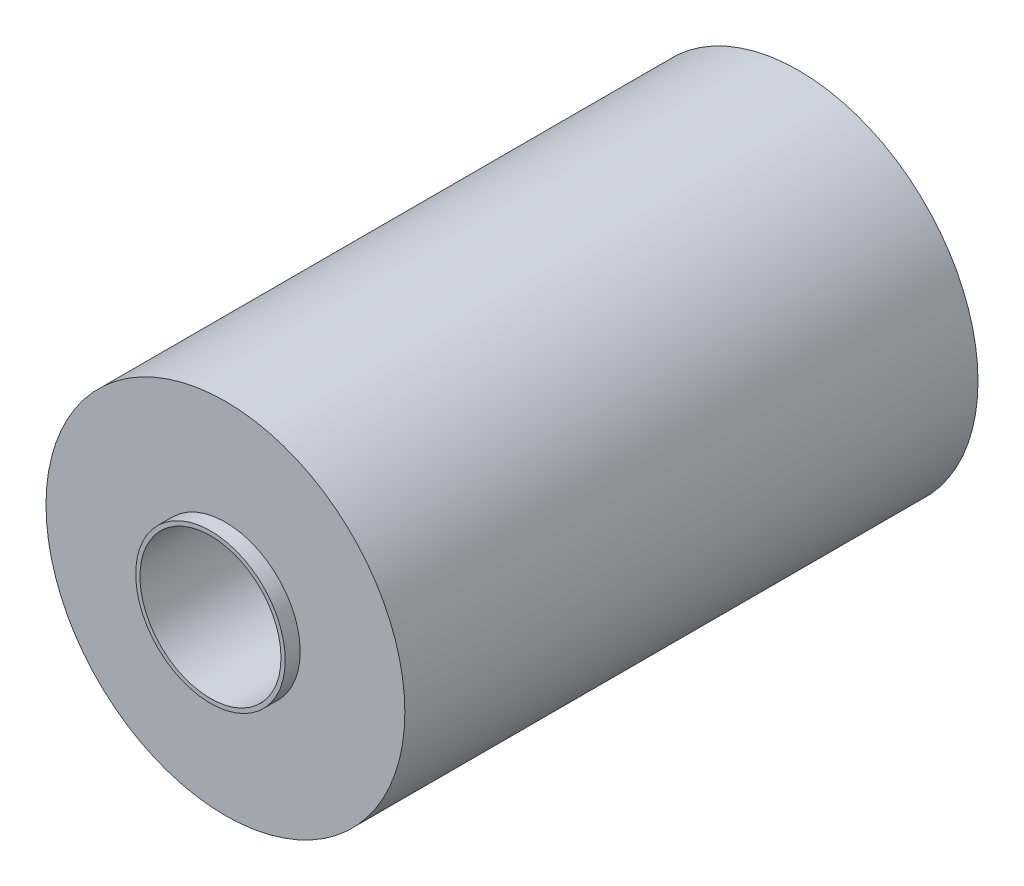
ISO-10303-21;
HEADER;
FILE_DESCRIPTION(('STEP AP214'),'2;1');
FILE_NAME('part.step','',(''),(''),'','','');
FILE_SCHEMA(('AUTOMOTIVE_DESIGN { 1 0 10303 214 1 1 1 1 }'));
ENDSEC;
DATA;
#1=APPLICATION_CONTEXT('core data for automotive mechanical design processes');
#2=APPLICATION_PROTOCOL_DEFINITION('international standard','automotive_design',2000,#1);
#3=PRODUCT_CONTEXT('',#1,'mechanical');
#4=PRODUCT('Part','Part','',(#3));
#5=PRODUCT_RELATED_PRODUCT_CATEGORY('part','',(#4));
#6=PRODUCT_DEFINITION_FORMATION('','',#4);
#7=PRODUCT_DEFINITION_CONTEXT('part definition',#1,'design');
#8=PRODUCT_DEFINITION('design','',#6,#7);
#9=PRODUCT_DEFINITION_SHAPE('','',#8);
#10=(LENGTH_UNIT() NAMED_UNIT(*) SI_UNIT(.MILLI.,.METRE.));
#11=(NAMED_UNIT(*) PLANE_ANGLE_UNIT() SI_UNIT($,.RADIAN.));
#12=(NAMED_UNIT(*) SI_UNIT($,.STERADIAN.) SOLID_ANGLE_UNIT());
#13=UNCERTAINTY_MEASURE_WITH_UNIT(LENGTH_MEASURE(1.E-05),#10,'distance_accuracy_value','');
#14=(GEOMETRIC_REPRESENTATION_CONTEXT(3) GLOBAL_UNCERTAINTY_ASSIGNED_CONTEXT((#13)) GLOBAL_UNIT_ASSIGNED_CONTEXT((#10,
#11,#12)) REPRESENTATION_CONTEXT('',''));
#15=CARTESIAN_POINT('',(0.,0.,0.));
#16=DIRECTION('',(0.,0.,1.));
#17=DIRECTION('',(1.,0.,0.));
#18=AXIS2_PLACEMENT_3D('',#15,#16,#17);
#19=CARTESIAN_POINT('',(0.,0.,105.926406871193));
#20=DIRECTION('',(0.,0.,-1.));
#21=DIRECTION('',(-1.,0.,0.));
#22=AXIS2_PLACEMENT_3D('',#19,#20,#21);
#23=CYLINDRICAL_SURFACE('',#22,15.);
#24=CARTESIAN_POINT('',(0.,0.,60.5));
#25=DIRECTION('',(0.,0.,1.));
#26=DIRECTION('',(1.,0.,0.));
#27=AXIS2_PLACEMENT_3D('',#24,#25,#26);
#28=CIRCLE('',#27,15.);
#29=CARTESIAN_POINT('',(15.,0.,60.5));
#30=VERTEX_POINT('',#29);
#31=EDGE_CURVE('E11',#30,#30,#28,.T.);
#32=ORIENTED_EDGE('',*,*,#31,.F.);
#33=EDGE_LOOP('',(#32));
#34=FACE_BOUND('',#33,.T.);
#35=CARTESIAN_POINT('',(0.,0.,-57.5));
#36=DIRECTION('',(0.,0.,1.));
#37=DIRECTION('',(1.,0.,0.));
#38=AXIS2_PLACEMENT_3D('',#35,#36,#37);
#39=CIRCLE('',#38,15.);
#40=CARTESIAN_POINT('',(15.,0.,-57.5));
#41=VERTEX_POINT('',#40);
#42=EDGE_CURVE('E61',#41,#41,#39,.F.);
#43=ORIENTED_EDGE('',*,*,#42,.F.);
#44=EDGE_LOOP('',(#43));
#45=FACE_BOUND('',#44,.T.);
#46=ADVANCED_FACE('F47',(#34,#45),#23,.T.);
#47=CARTESIAN_POINT('',(0.,0.,105.926406871193));
#48=DIRECTION('',(0.,0.,-1.));
#49=DIRECTION('',(-1.,0.,0.));
#50=AXIS2_PLACEMENT_3D('',#47,#48,#49);
#51=CYLINDRICAL_SURFACE('',#50,14.15);
#52=CARTESIAN_POINT('',(0.,0.,60.5));
#53=DIRECTION('',(0.,0.,1.));
#54=DIRECTION('',(1.,0.,0.));
#55=AXIS2_PLACEMENT_3D('',#52,#53,#54);
#56=CIRCLE('',#55,14.15);
#57=CARTESIAN_POINT('',(14.15,0.,60.5));
#58=VERTEX_POINT('',#57);
#59=EDGE_CURVE('E50',#58,#58,#56,.T.);
#60=ORIENTED_EDGE('',*,*,#59,.T.);
#61=EDGE_LOOP('',(#60));
#62=FACE_BOUND('',#61,.T.);
#63=CARTESIAN_POINT('',(0.,0.,-57.5));
#64=DIRECTION('',(0.,0.,1.));
#65=DIRECTION('',(1.,0.,0.));
#66=AXIS2_PLACEMENT_3D('',#63,#64,#65);
#67=CIRCLE('',#66,14.15);
#68=CARTESIAN_POINT('',(14.15,0.,-57.5));
#69=VERTEX_POINT('',#68);
#70=EDGE_CURVE('E57',#69,#69,#67,.F.);
#71=ORIENTED_EDGE('',*,*,#70,.T.);
#72=EDGE_LOOP('',(#71));
#73=FACE_BOUND('',#72,.T.);
#74=ADVANCED_FACE('F69',(#62,#73),#51,.F.);
#75=CARTESIAN_POINT('',(0.,0.,60.5));
#76=DIRECTION('',(0.,0.,1.));
#77=DIRECTION('',(1.,0.,0.));
#78=AXIS2_PLACEMENT_3D('',#75,#76,#77);
#79=PLANE('',#78);
#80=ORIENTED_EDGE('',*,*,#59,.F.);
#81=EDGE_LOOP('',(#80));
#82=FACE_BOUND('',#81,.T.);
#83=ORIENTED_EDGE('',*,*,#31,.T.);
#84=EDGE_LOOP('',(#83));
#85=FACE_BOUND('',#84,.T.);
#86=ADVANCED_FACE('F74',(#82,#85),#79,.T.);
#87=CARTESIAN_POINT('',(0.,0.,-57.5));
#88=DIRECTION('',(0.,0.,1.));
#89=DIRECTION('',(1.,0.,0.));
#90=AXIS2_PLACEMENT_3D('',#87,#88,#89);
#91=PLANE('',#90);
#92=ORIENTED_EDGE('',*,*,#42,.T.);
#93=EDGE_LOOP('',(#92));
#94=FACE_BOUND('',#93,.T.);
#95=ORIENTED_EDGE('',*,*,#70,.F.);
#96=EDGE_LOOP('',(#95));
#97=FACE_BOUND('',#96,.T.);
#98=ADVANCED_FACE('F65',(#94,#97),#91,.F.);
#99=CLOSED_SHELL('',(#46,#74,#86,#98));
#100=MANIFOLD_SOLID_BREP('B2',#99);
#101=CARTESIAN_POINT('',(0.,0.,57.5));
#102=DIRECTION('',(0.,0.,1.));
#103=DIRECTION('',(1.,0.,0.));
#104=AXIS2_PLACEMENT_3D('',#101,#102,#103);
#105=PLANE('',#104);
#106=CARTESIAN_POINT('',(0.,0.,57.5));
#107=DIRECTION('',(0.,0.,1.));
#108=DIRECTION('',(1.,0.,0.));
#109=AXIS2_PLACEMENT_3D('',#106,#107,#108);
#110=CIRCLE('',#109,36.);
#111=CARTESIAN_POINT('',(36.,0.,57.5));
#112=VERTEX_POINT('',#111);
#113=EDGE_CURVE('E46',#112,#112,#110,.T.);
#114=ORIENTED_EDGE('',*,*,#113,.T.);
#115=EDGE_LOOP('',(#114));
#116=FACE_BOUND('',#115,.T.);
#117=CARTESIAN_POINT('',(0.,0.,57.5));
#118=DIRECTION('',(0.,0.,1.));
#119=DIRECTION('',(1.,0.,0.));
#120=AXIS2_PLACEMENT_3D('',#117,#118,#119);
#121=CIRCLE('',#120,15.);
#122=CARTESIAN_POINT('',(15.,0.,57.5));
#123=VERTEX_POINT('',#122);
#124=EDGE_CURVE('E120',#123,#123,#121,.T.);
#125=ORIENTED_EDGE('',*,*,#124,.F.);
#126=EDGE_LOOP('',(#125));
#127=FACE_BOUND('',#126,.T.);
#128=ADVANCED_FACE('F109',(#116,#127),#105,.T.);
#129=CARTESIAN_POINT('',(0.,0.,-57.5));
#130=DIRECTION('',(0.,0.,1.));
#131=DIRECTION('',(1.,0.,0.));
#132=AXIS2_PLACEMENT_3D('',#129,#130,#131);
#133=PLANE('',#132);
#134=CARTESIAN_POINT('',(0.,0.,-57.5));
#135=DIRECTION('',(0.,0.,1.));
#136=DIRECTION('',(1.,0.,0.));
#137=AXIS2_PLACEMENT_3D('',#134,#135,#136);
#138=CIRCLE('',#137,36.);
#139=CARTESIAN_POINT('',(36.,0.,-57.5));
#140=VERTEX_POINT('',#139);
#141=EDGE_CURVE('E113',#140,#140,#138,.T.);
#142=ORIENTED_EDGE('',*,*,#141,.F.);
#143=EDGE_LOOP('',(#142));
#144=FACE_BOUND('',#143,.T.);
#145=CARTESIAN_POINT('',(0.,0.,-57.5));
#146=DIRECTION('',(0.,0.,1.));
#147=DIRECTION('',(1.,0.,0.));
#148=AXIS2_PLACEMENT_3D('',#145,#146,#147);
#149=CIRCLE('',#148,15.);
#150=CARTESIAN_POINT('',(15.,0.,-57.5));
#151=VERTEX_POINT('',#150);
#152=EDGE_CURVE('E122',#151,#151,#149,.T.);
#153=ORIENTED_EDGE('',*,*,#152,.T.);
#154=EDGE_LOOP('',(#153));
#155=FACE_BOUND('',#154,.T.);
#156=ADVANCED_FACE('F132',(#144,#155),#133,.F.);
#157=CARTESIAN_POINT('',(0.,0.,57.5));
#158=DIRECTION('',(0.,0.,-1.));
#159=DIRECTION('',(-1.,0.,0.));
#160=AXIS2_PLACEMENT_3D('',#157,#158,#159);
#161=CYLINDRICAL_SURFACE('',#160,36.);
#162=ORIENTED_EDGE('',*,*,#113,.F.);
#163=EDGE_LOOP('',(#162));
#164=FACE_BOUND('',#163,.T.);
#165=ORIENTED_EDGE('',*,*,#141,.T.);
#166=EDGE_LOOP('',(#165));
#167=FACE_BOUND('',#166,.T.);
#168=ADVANCED_FACE('F111',(#164,#167),#161,.T.);
#169=CARTESIAN_POINT('',(0.,0.,57.5));
#170=DIRECTION('',(0.,0.,-1.));
#171=DIRECTION('',(-1.,0.,0.));
#172=AXIS2_PLACEMENT_3D('',#169,#170,#171);
#173=CYLINDRICAL_SURFACE('',#172,15.);
#174=ORIENTED_EDGE('',*,*,#124,.T.);
#175=EDGE_LOOP('',(#174));
#176=FACE_BOUND('',#175,.T.);
#177=ORIENTED_EDGE('',*,*,#152,.F.);
#178=EDGE_LOOP('',(#177));
#179=FACE_BOUND('',#178,.T.);
#180=ADVANCED_FACE('F128',(#176,#179),#173,.F.);
#181=CLOSED_SHELL('',(#128,#156,#168,#180));
#182=MANIFOLD_SOLID_BREP('B6',#181);
#183=ADVANCED_BREP_SHAPE_REPRESENTATION('',(#18,#100,#182),#14);
#184=SHAPE_DEFINITION_REPRESENTATION(#9,#183);
ENDSEC;
END-ISO-10303-21;
